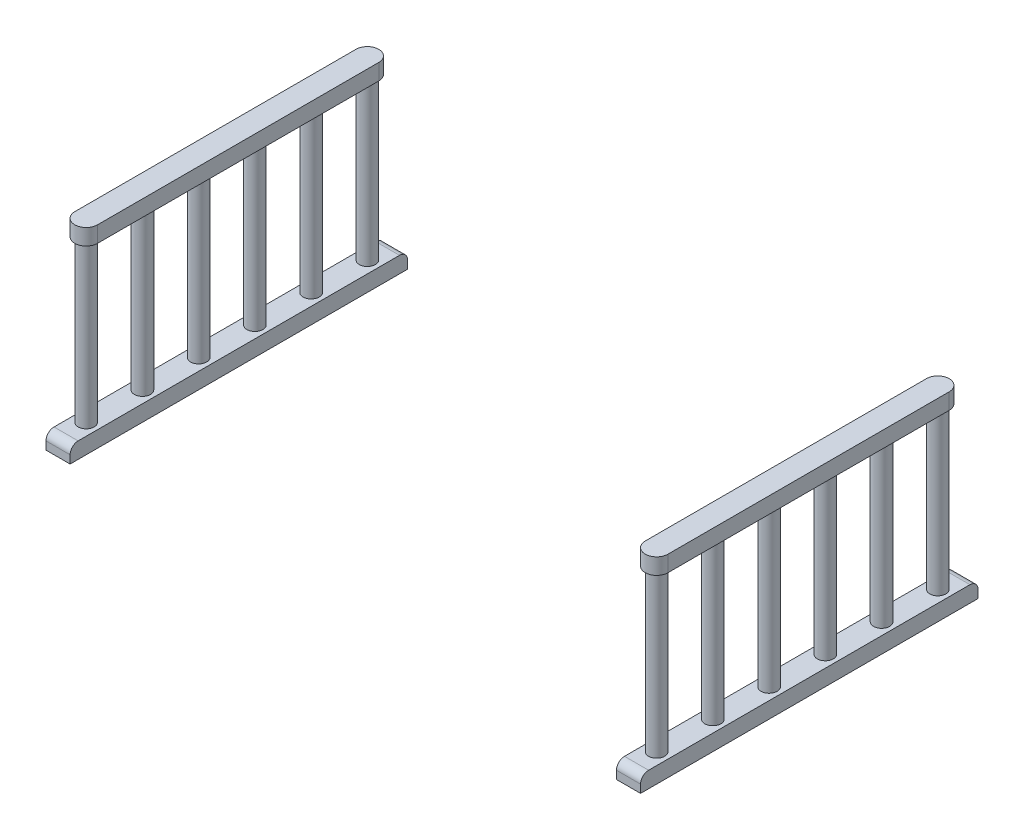
ISO-10303-21;
HEADER;
FILE_DESCRIPTION(('STEP AP214'),'2;1');
FILE_NAME('part.step','',(''),(''),'','','');
FILE_SCHEMA(('AUTOMOTIVE_DESIGN { 1 0 10303 214 1 1 1 1 }'));
ENDSEC;
DATA;
#1=APPLICATION_CONTEXT('core data for automotive mechanical design processes');
#2=APPLICATION_PROTOCOL_DEFINITION('international standard','automotive_design',2000,#1);
#3=PRODUCT_CONTEXT('',#1,'mechanical');
#4=PRODUCT('Part','Part','',(#3));
#5=PRODUCT_RELATED_PRODUCT_CATEGORY('part','',(#4));
#6=PRODUCT_DEFINITION_FORMATION('','',#4);
#7=PRODUCT_DEFINITION_CONTEXT('part definition',#1,'design');
#8=PRODUCT_DEFINITION('design','',#6,#7);
#9=PRODUCT_DEFINITION_SHAPE('','',#8);
#10=(LENGTH_UNIT() NAMED_UNIT(*) SI_UNIT(.MILLI.,.METRE.));
#11=(NAMED_UNIT(*) PLANE_ANGLE_UNIT() SI_UNIT($,.RADIAN.));
#12=(NAMED_UNIT(*) SI_UNIT($,.STERADIAN.) SOLID_ANGLE_UNIT());
#13=UNCERTAINTY_MEASURE_WITH_UNIT(LENGTH_MEASURE(1.E-05),#10,'distance_accuracy_value','');
#14=(GEOMETRIC_REPRESENTATION_CONTEXT(3) GLOBAL_UNCERTAINTY_ASSIGNED_CONTEXT((#13)) GLOBAL_UNIT_ASSIGNED_CONTEXT((#10,
#11,#12)) REPRESENTATION_CONTEXT('',''));
#15=CARTESIAN_POINT('',(0.,0.,0.));
#16=DIRECTION('',(0.,0.,1.));
#17=DIRECTION('',(1.,0.,0.));
#18=AXIS2_PLACEMENT_3D('',#15,#16,#17);
#19=CARTESIAN_POINT('',(-1775.,1100.,-1912.97595190381));
#20=DIRECTION('',(0.,-1.,0.));
#21=DIRECTION('',(0.,0.,-1.));
#22=AXIS2_PLACEMENT_3D('',#19,#20,#21);
#23=CYLINDRICAL_SURFACE('',#22,50.);
#24=CARTESIAN_POINT('',(-1775.,1100.,-1912.97595190381));
#25=DIRECTION('',(0.,1.,0.));
#26=DIRECTION('',(0.,0.,1.));
#27=AXIS2_PLACEMENT_3D('',#24,#25,#26);
#28=CIRCLE('',#27,50.);
#29=CARTESIAN_POINT('',(-1775.,1100.,-1862.97595190381));
#30=VERTEX_POINT('',#29);
#31=EDGE_CURVE('E244',#30,#30,#28,.T.);
#32=ORIENTED_EDGE('',*,*,#31,.F.);
#33=EDGE_LOOP('',(#32));
#34=FACE_BOUND('',#33,.T.);
#35=CARTESIAN_POINT('',(-1775.,100.,-1912.97595190381));
#36=DIRECTION('',(0.,-1.,0.));
#37=DIRECTION('',(0.,0.,-1.));
#38=AXIS2_PLACEMENT_3D('',#35,#36,#37);
#39=CIRCLE('',#38,50.);
#40=CARTESIAN_POINT('',(-1775.,100.,-1962.97595190381));
#41=VERTEX_POINT('',#40);
#42=EDGE_CURVE('E240',#41,#41,#39,.F.);
#43=ORIENTED_EDGE('',*,*,#42,.T.);
#44=EDGE_LOOP('',(#43));
#45=FACE_BOUND('',#44,.T.);
#46=ADVANCED_FACE('F55',(#34,#45),#23,.T.);
#47=CARTESIAN_POINT('',(-1775.,1100.,-1562.97595190381));
#48=DIRECTION('',(0.,-1.,0.));
#49=DIRECTION('',(0.,0.,-1.));
#50=AXIS2_PLACEMENT_3D('',#47,#48,#49);
#51=CYLINDRICAL_SURFACE('',#50,50.);
#52=CARTESIAN_POINT('',(-1775.,1100.,-1562.97595190381));
#53=DIRECTION('',(0.,1.,0.));
#54=DIRECTION('',(0.,0.,1.));
#55=AXIS2_PLACEMENT_3D('',#52,#53,#54);
#56=CIRCLE('',#55,50.);
#57=CARTESIAN_POINT('',(-1775.,1100.,-1512.97595190381));
#58=VERTEX_POINT('',#57);
#59=EDGE_CURVE('E236',#58,#58,#56,.T.);
#60=ORIENTED_EDGE('',*,*,#59,.F.);
#61=EDGE_LOOP('',(#60));
#62=FACE_BOUND('',#61,.T.);
#63=CARTESIAN_POINT('',(-1775.,100.,-1562.97595190381));
#64=DIRECTION('',(0.,-1.,0.));
#65=DIRECTION('',(0.,0.,-1.));
#66=AXIS2_PLACEMENT_3D('',#63,#64,#65);
#67=CIRCLE('',#66,50.);
#68=CARTESIAN_POINT('',(-1775.,100.,-1612.97595190381));
#69=VERTEX_POINT('',#68);
#70=EDGE_CURVE('E232',#69,#69,#67,.F.);
#71=ORIENTED_EDGE('',*,*,#70,.T.);
#72=EDGE_LOOP('',(#71));
#73=FACE_BOUND('',#72,.T.);
#74=ADVANCED_FACE('F294',(#62,#73),#51,.T.);
#75=CARTESIAN_POINT('',(-1775.,1100.,-1212.97595190381));
#76=DIRECTION('',(0.,-1.,0.));
#77=DIRECTION('',(0.,0.,-1.));
#78=AXIS2_PLACEMENT_3D('',#75,#76,#77);
#79=CYLINDRICAL_SURFACE('',#78,50.);
#80=CARTESIAN_POINT('',(-1775.,1100.,-1212.97595190381));
#81=DIRECTION('',(0.,1.,0.));
#82=DIRECTION('',(0.,0.,1.));
#83=AXIS2_PLACEMENT_3D('',#80,#81,#82);
#84=CIRCLE('',#83,50.);
#85=CARTESIAN_POINT('',(-1775.,1100.,-1162.97595190381));
#86=VERTEX_POINT('',#85);
#87=EDGE_CURVE('E228',#86,#86,#84,.T.);
#88=ORIENTED_EDGE('',*,*,#87,.F.);
#89=EDGE_LOOP('',(#88));
#90=FACE_BOUND('',#89,.T.);
#91=CARTESIAN_POINT('',(-1775.,100.,-1212.97595190381));
#92=DIRECTION('',(0.,-1.,0.));
#93=DIRECTION('',(0.,0.,-1.));
#94=AXIS2_PLACEMENT_3D('',#91,#92,#93);
#95=CIRCLE('',#94,50.);
#96=CARTESIAN_POINT('',(-1775.,100.,-1262.97595190381));
#97=VERTEX_POINT('',#96);
#98=EDGE_CURVE('E224',#97,#97,#95,.F.);
#99=ORIENTED_EDGE('',*,*,#98,.T.);
#100=EDGE_LOOP('',(#99));
#101=FACE_BOUND('',#100,.T.);
#102=ADVANCED_FACE('F301',(#90,#101),#79,.T.);
#103=CARTESIAN_POINT('',(-1775.,1100.,-862.975951903808));
#104=DIRECTION('',(0.,-1.,0.));
#105=DIRECTION('',(0.,0.,-1.));
#106=AXIS2_PLACEMENT_3D('',#103,#104,#105);
#107=CYLINDRICAL_SURFACE('',#106,50.);
#108=CARTESIAN_POINT('',(-1775.,1100.,-862.975951903808));
#109=DIRECTION('',(0.,1.,0.));
#110=DIRECTION('',(0.,0.,1.));
#111=AXIS2_PLACEMENT_3D('',#108,#109,#110);
#112=CIRCLE('',#111,50.);
#113=CARTESIAN_POINT('',(-1775.,1100.,-812.975951903807));
#114=VERTEX_POINT('',#113);
#115=EDGE_CURVE('E220',#114,#114,#112,.T.);
#116=ORIENTED_EDGE('',*,*,#115,.F.);
#117=EDGE_LOOP('',(#116));
#118=FACE_BOUND('',#117,.T.);
#119=CARTESIAN_POINT('',(-1775.,100.,-862.975951903808));
#120=DIRECTION('',(0.,-1.,0.));
#121=DIRECTION('',(0.,0.,-1.));
#122=AXIS2_PLACEMENT_3D('',#119,#120,#121);
#123=CIRCLE('',#122,50.);
#124=CARTESIAN_POINT('',(-1775.,100.,-912.975951903808));
#125=VERTEX_POINT('',#124);
#126=EDGE_CURVE('E216',#125,#125,#123,.F.);
#127=ORIENTED_EDGE('',*,*,#126,.T.);
#128=EDGE_LOOP('',(#127));
#129=FACE_BOUND('',#128,.T.);
#130=ADVANCED_FACE('F309',(#118,#129),#107,.T.);
#131=CARTESIAN_POINT('',(-1850.,100.,12.0240480961924));
#132=DIRECTION('',(1.,0.,0.));
#133=DIRECTION('',(0.,0.,-1.));
#134=AXIS2_PLACEMENT_3D('',#131,#132,#133);
#135=PLANE('',#134);
#136=DIRECTION('',(0.,-1.,0.));
#137=VECTOR('',#136,1.);
#138=CARTESIAN_POINT('',(-1850.,100.,12.0240480961924));
#139=LINE('',#138,#137);
#140=CARTESIAN_POINT('',(-1850.,50.,12.0240480961924));
#141=VERTEX_POINT('',#140);
#142=CARTESIAN_POINT('',(-1850.,0.,12.0240480961924));
#143=VERTEX_POINT('',#142);
#144=EDGE_CURVE('E173',#141,#143,#139,.T.);
#145=ORIENTED_EDGE('',*,*,#144,.F.);
#146=CARTESIAN_POINT('',(-1850.,50.,-37.9759519038076));
#147=DIRECTION('',(1.,0.,0.));
#148=DIRECTION('',(0.,0.,-1.));
#149=AXIS2_PLACEMENT_3D('',#146,#147,#148);
#150=CIRCLE('',#149,50.);
#151=CARTESIAN_POINT('',(-1850.,100.,-37.9759519038076));
#152=VERTEX_POINT('',#151);
#153=EDGE_CURVE('E12',#141,#152,#150,.F.);
#154=ORIENTED_EDGE('',*,*,#153,.T.);
#155=DIRECTION('',(0.,0.,1.));
#156=VECTOR('',#155,1.);
#157=CARTESIAN_POINT('',(-1850.,100.,12.0240480961924));
#158=LINE('',#157,#156);
#159=CARTESIAN_POINT('',(-1850.,100.,-2037.97595190381));
#160=VERTEX_POINT('',#159);
#161=EDGE_CURVE('E191',#160,#152,#158,.T.);
#162=ORIENTED_EDGE('',*,*,#161,.F.);
#163=CARTESIAN_POINT('',(-1850.,50.,-2037.97595190381));
#164=DIRECTION('',(1.,0.,0.));
#165=DIRECTION('',(0.,0.,-1.));
#166=AXIS2_PLACEMENT_3D('',#163,#164,#165);
#167=CIRCLE('',#166,50.);
#168=CARTESIAN_POINT('',(-1850.,50.,-2087.97595190381));
#169=VERTEX_POINT('',#168);
#170=EDGE_CURVE('E252',#160,#169,#167,.F.);
#171=ORIENTED_EDGE('',*,*,#170,.T.);
#172=DIRECTION('',(0.,-1.,0.));
#173=VECTOR('',#172,1.);
#174=CARTESIAN_POINT('',(-1850.,100.,-2087.97595190381));
#175=LINE('',#174,#173);
#176=CARTESIAN_POINT('',(-1850.,0.,-2087.97595190381));
#177=VERTEX_POINT('',#176);
#178=EDGE_CURVE('E182',#169,#177,#175,.T.);
#179=ORIENTED_EDGE('',*,*,#178,.T.);
#180=DIRECTION('',(0.,0.,1.));
#181=VECTOR('',#180,1.);
#182=CARTESIAN_POINT('',(-1850.,0.,12.0240480961924));
#183=LINE('',#182,#181);
#184=EDGE_CURVE('E199',#177,#143,#183,.T.);
#185=ORIENTED_EDGE('',*,*,#184,.T.);
#186=EDGE_LOOP('',(#145,#154,#162,#171,#179,#185));
#187=FACE_BOUND('',#186,.T.);
#188=ADVANCED_FACE('F283',(#187),#135,.F.);
#189=CARTESIAN_POINT('',(-1850.,100.,12.0240480961924));
#190=DIRECTION('',(0.,0.,-1.));
#191=DIRECTION('',(-1.,0.,0.));
#192=AXIS2_PLACEMENT_3D('',#189,#190,#191);
#193=PLANE('',#192);
#194=DIRECTION('',(0.,-1.,0.));
#195=VECTOR('',#194,1.);
#196=CARTESIAN_POINT('',(-1700.,100.,12.0240480961924));
#197=LINE('',#196,#195);
#198=CARTESIAN_POINT('',(-1700.,50.,12.0240480961924));
#199=VERTEX_POINT('',#198);
#200=CARTESIAN_POINT('',(-1700.,0.,12.0240480961924));
#201=VERTEX_POINT('',#200);
#202=EDGE_CURVE('E176',#199,#201,#197,.T.);
#203=ORIENTED_EDGE('',*,*,#202,.F.);
#204=DIRECTION('',(1.,0.,0.));
#205=VECTOR('',#204,1.);
#206=CARTESIAN_POINT('',(-1850.,50.,12.0240480961924));
#207=LINE('',#206,#205);
#208=EDGE_CURVE('E64',#199,#141,#207,.F.);
#209=ORIENTED_EDGE('',*,*,#208,.T.);
#210=ORIENTED_EDGE('',*,*,#144,.T.);
#211=DIRECTION('',(1.,0.,0.));
#212=VECTOR('',#211,1.);
#213=CARTESIAN_POINT('',(-1850.,0.,12.0240480961924));
#214=LINE('',#213,#212);
#215=EDGE_CURVE('E195',#143,#201,#214,.T.);
#216=ORIENTED_EDGE('',*,*,#215,.T.);
#217=EDGE_LOOP('',(#203,#209,#210,#216));
#218=FACE_BOUND('',#217,.T.);
#219=ADVANCED_FACE('F327',(#218),#193,.F.);
#220=CARTESIAN_POINT('',(-1700.,100.,12.0240480961924));
#221=DIRECTION('',(-1.,0.,0.));
#222=DIRECTION('',(0.,0.,1.));
#223=AXIS2_PLACEMENT_3D('',#220,#221,#222);
#224=PLANE('',#223);
#225=DIRECTION('',(0.,0.,-1.));
#226=VECTOR('',#225,1.);
#227=CARTESIAN_POINT('',(-1700.,100.,12.0240480961924));
#228=LINE('',#227,#226);
#229=CARTESIAN_POINT('',(-1700.,100.,-37.9759519038076));
#230=VERTEX_POINT('',#229);
#231=CARTESIAN_POINT('',(-1700.,100.,-2037.97595190381));
#232=VERTEX_POINT('',#231);
#233=EDGE_CURVE('E185',#230,#232,#228,.T.);
#234=ORIENTED_EDGE('',*,*,#233,.F.);
#235=CARTESIAN_POINT('',(-1700.,50.,-37.9759519038076));
#236=DIRECTION('',(-1.,0.,0.));
#237=DIRECTION('',(0.,0.,1.));
#238=AXIS2_PLACEMENT_3D('',#235,#236,#237);
#239=CIRCLE('',#238,50.);
#240=EDGE_CURVE('E78',#230,#199,#239,.F.);
#241=ORIENTED_EDGE('',*,*,#240,.T.);
#242=ORIENTED_EDGE('',*,*,#202,.T.);
#243=DIRECTION('',(0.,0.,-1.));
#244=VECTOR('',#243,1.);
#245=CARTESIAN_POINT('',(-1700.,0.,12.0240480961924));
#246=LINE('',#245,#244);
#247=CARTESIAN_POINT('',(-1700.,0.,-2087.97595190381));
#248=VERTEX_POINT('',#247);
#249=EDGE_CURVE('E190',#201,#248,#246,.T.);
#250=ORIENTED_EDGE('',*,*,#249,.T.);
#251=DIRECTION('',(0.,-1.,0.));
#252=VECTOR('',#251,1.);
#253=CARTESIAN_POINT('',(-1700.,100.,-2087.97595190381));
#254=LINE('',#253,#252);
#255=CARTESIAN_POINT('',(-1700.,50.,-2087.97595190381));
#256=VERTEX_POINT('',#255);
#257=EDGE_CURVE('E179',#256,#248,#254,.T.);
#258=ORIENTED_EDGE('',*,*,#257,.F.);
#259=CARTESIAN_POINT('',(-1700.,50.,-2037.97595190381));
#260=DIRECTION('',(-1.,0.,0.));
#261=DIRECTION('',(0.,0.,1.));
#262=AXIS2_PLACEMENT_3D('',#259,#260,#261);
#263=CIRCLE('',#262,50.);
#264=EDGE_CURVE('E258',#256,#232,#263,.F.);
#265=ORIENTED_EDGE('',*,*,#264,.T.);
#266=EDGE_LOOP('',(#234,#241,#242,#250,#258,#265));
#267=FACE_BOUND('',#266,.T.);
#268=ADVANCED_FACE('F275',(#267),#224,.F.);
#269=CARTESIAN_POINT('',(-1850.,100.,-2087.97595190381));
#270=DIRECTION('',(0.,0.,1.));
#271=DIRECTION('',(1.,0.,0.));
#272=AXIS2_PLACEMENT_3D('',#269,#270,#271);
#273=PLANE('',#272);
#274=ORIENTED_EDGE('',*,*,#178,.F.);
#275=DIRECTION('',(-1.,0.,0.));
#276=VECTOR('',#275,1.);
#277=CARTESIAN_POINT('',(-1850.,50.,-2087.97595190381));
#278=LINE('',#277,#276);
#279=EDGE_CURVE('E255',#169,#256,#278,.F.);
#280=ORIENTED_EDGE('',*,*,#279,.T.);
#281=ORIENTED_EDGE('',*,*,#257,.T.);
#282=DIRECTION('',(-1.,0.,0.));
#283=VECTOR('',#282,1.);
#284=CARTESIAN_POINT('',(-1850.,0.,-2087.97595190381));
#285=LINE('',#284,#283);
#286=EDGE_CURVE('E186',#248,#177,#285,.T.);
#287=ORIENTED_EDGE('',*,*,#286,.T.);
#288=EDGE_LOOP('',(#274,#280,#281,#287));
#289=FACE_BOUND('',#288,.T.);
#290=ADVANCED_FACE('F316',(#289),#273,.F.);
#291=CARTESIAN_POINT('',(0.,100.,0.));
#292=DIRECTION('',(0.,-1.,0.));
#293=DIRECTION('',(0.,0.,-1.));
#294=AXIS2_PLACEMENT_3D('',#291,#292,#293);
#295=PLANE('',#294);
#296=CARTESIAN_POINT('',(-1775.,100.,-512.975951903808));
#297=DIRECTION('',(0.,-1.,0.));
#298=DIRECTION('',(0.,0.,-1.));
#299=AXIS2_PLACEMENT_3D('',#296,#297,#298);
#300=CIRCLE('',#299,50.);
#301=CARTESIAN_POINT('',(-1775.,100.,-562.975951903808));
#302=VERTEX_POINT('',#301);
#303=EDGE_CURVE('E212',#302,#302,#300,.F.);
#304=ORIENTED_EDGE('',*,*,#303,.F.);
#305=EDGE_LOOP('',(#304));
#306=FACE_BOUND('',#305,.T.);
#307=CARTESIAN_POINT('',(-1775.,100.,-162.975951903808));
#308=DIRECTION('',(0.,-1.,0.));
#309=DIRECTION('',(0.,0.,-1.));
#310=AXIS2_PLACEMENT_3D('',#307,#308,#309);
#311=CIRCLE('',#310,50.);
#312=CARTESIAN_POINT('',(-1775.,100.,-212.975951903808));
#313=VERTEX_POINT('',#312);
#314=EDGE_CURVE('E203',#313,#313,#311,.F.);
#315=ORIENTED_EDGE('',*,*,#314,.F.);
#316=EDGE_LOOP('',(#315));
#317=FACE_BOUND('',#316,.T.);
#318=ORIENTED_EDGE('',*,*,#161,.T.);
#319=DIRECTION('',(1.,0.,0.));
#320=VECTOR('',#319,1.);
#321=CARTESIAN_POINT('',(0.,100.,-37.9759519038076));
#322=LINE('',#321,#320);
#323=EDGE_CURVE('E262',#152,#230,#322,.T.);
#324=ORIENTED_EDGE('',*,*,#323,.T.);
#325=ORIENTED_EDGE('',*,*,#233,.T.);
#326=DIRECTION('',(-1.,0.,0.));
#327=VECTOR('',#326,1.);
#328=CARTESIAN_POINT('',(0.,100.,-2037.97595190381));
#329=LINE('',#328,#327);
#330=EDGE_CURVE('E248',#232,#160,#329,.T.);
#331=ORIENTED_EDGE('',*,*,#330,.T.);
#332=EDGE_LOOP('',(#318,#324,#325,#331));
#333=FACE_BOUND('',#332,.T.);
#334=ORIENTED_EDGE('',*,*,#126,.F.);
#335=EDGE_LOOP('',(#334));
#336=FACE_BOUND('',#335,.T.);
#337=ORIENTED_EDGE('',*,*,#98,.F.);
#338=EDGE_LOOP('',(#337));
#339=FACE_BOUND('',#338,.T.);
#340=ORIENTED_EDGE('',*,*,#70,.F.);
#341=EDGE_LOOP('',(#340));
#342=FACE_BOUND('',#341,.T.);
#343=ORIENTED_EDGE('',*,*,#42,.F.);
#344=EDGE_LOOP('',(#343));
#345=FACE_BOUND('',#344,.T.);
#346=ADVANCED_FACE('F270',(#306,#317,#333,#336,#339,#342,#345),#295,.F.);
#347=CARTESIAN_POINT('',(0.,0.,0.));
#348=DIRECTION('',(0.,-1.,0.));
#349=DIRECTION('',(0.,0.,-1.));
#350=AXIS2_PLACEMENT_3D('',#347,#348,#349);
#351=PLANE('',#350);
#352=ORIENTED_EDGE('',*,*,#184,.F.);
#353=ORIENTED_EDGE('',*,*,#286,.F.);
#354=ORIENTED_EDGE('',*,*,#249,.F.);
#355=ORIENTED_EDGE('',*,*,#215,.F.);
#356=EDGE_LOOP('',(#352,#353,#354,#355));
#357=FACE_BOUND('',#356,.T.);
#358=ADVANCED_FACE('F315',(#357),#351,.T.);
#359=CARTESIAN_POINT('',(-1775.,1100.,-162.975951903808));
#360=DIRECTION('',(0.,-1.,0.));
#361=DIRECTION('',(0.,0.,-1.));
#362=AXIS2_PLACEMENT_3D('',#359,#360,#361);
#363=CYLINDRICAL_SURFACE('',#362,50.);
#364=CARTESIAN_POINT('',(-1775.,1100.,-162.975951903808));
#365=DIRECTION('',(0.,1.,0.));
#366=DIRECTION('',(0.,0.,1.));
#367=AXIS2_PLACEMENT_3D('',#364,#365,#366);
#368=CIRCLE('',#367,50.);
#369=CARTESIAN_POINT('',(-1775.,1100.,-112.975951903808));
#370=VERTEX_POINT('',#369);
#371=EDGE_CURVE('E164',#370,#370,#368,.T.);
#372=ORIENTED_EDGE('',*,*,#371,.F.);
#373=EDGE_LOOP('',(#372));
#374=FACE_BOUND('',#373,.T.);
#375=ORIENTED_EDGE('',*,*,#314,.T.);
#376=EDGE_LOOP('',(#375));
#377=FACE_BOUND('',#376,.T.);
#378=ADVANCED_FACE('F320',(#374,#377),#363,.T.);
#379=CARTESIAN_POINT('',(-1775.,1100.,-512.975951903808));
#380=DIRECTION('',(0.,-1.,0.));
#381=DIRECTION('',(0.,0.,-1.));
#382=AXIS2_PLACEMENT_3D('',#379,#380,#381);
#383=CYLINDRICAL_SURFACE('',#382,50.);
#384=CARTESIAN_POINT('',(-1775.,1100.,-512.975951903808));
#385=DIRECTION('',(0.,1.,0.));
#386=DIRECTION('',(0.,0.,1.));
#387=AXIS2_PLACEMENT_3D('',#384,#385,#386);
#388=CIRCLE('',#387,50.);
#389=CARTESIAN_POINT('',(-1775.,1100.,-462.975951903807));
#390=VERTEX_POINT('',#389);
#391=EDGE_CURVE('E159',#390,#390,#388,.T.);
#392=ORIENTED_EDGE('',*,*,#391,.F.);
#393=EDGE_LOOP('',(#392));
#394=FACE_BOUND('',#393,.T.);
#395=ORIENTED_EDGE('',*,*,#303,.T.);
#396=EDGE_LOOP('',(#395));
#397=FACE_BOUND('',#396,.T.);
#398=ADVANCED_FACE('F292',(#394,#397),#383,.T.);
#399=CARTESIAN_POINT('',(0.,50.,-2037.97595190381));
#400=DIRECTION('',(-1.,0.,0.));
#401=DIRECTION('',(0.,0.,1.));
#402=AXIS2_PLACEMENT_3D('',#399,#400,#401);
#403=CYLINDRICAL_SURFACE('',#402,50.);
#404=ORIENTED_EDGE('',*,*,#264,.F.);
#405=ORIENTED_EDGE('',*,*,#279,.F.);
#406=ORIENTED_EDGE('',*,*,#170,.F.);
#407=ORIENTED_EDGE('',*,*,#330,.F.);
#408=EDGE_LOOP('',(#404,#405,#406,#407));
#409=FACE_BOUND('',#408,.T.);
#410=ADVANCED_FACE('F281',(#409),#403,.T.);
#411=CARTESIAN_POINT('',(0.,50.,-37.9759519038076));
#412=DIRECTION('',(1.,0.,0.));
#413=DIRECTION('',(0.,0.,-1.));
#414=AXIS2_PLACEMENT_3D('',#411,#412,#413);
#415=CYLINDRICAL_SURFACE('',#414,50.);
#416=ORIENTED_EDGE('',*,*,#153,.F.);
#417=ORIENTED_EDGE('',*,*,#208,.F.);
#418=ORIENTED_EDGE('',*,*,#240,.F.);
#419=ORIENTED_EDGE('',*,*,#323,.F.);
#420=EDGE_LOOP('',(#416,#417,#418,#419));
#421=FACE_BOUND('',#420,.T.);
#422=ADVANCED_FACE('F57',(#421),#415,.T.);
#423=CARTESIAN_POINT('',(-1775.,1200.,-162.975951903808));
#424=DIRECTION('',(0.,-1.,0.));
#425=DIRECTION('',(0.,0.,-1.));
#426=AXIS2_PLACEMENT_3D('',#423,#424,#425);
#427=CYLINDRICAL_SURFACE('',#426,70.8383393209071);
#428=CARTESIAN_POINT('',(-1775.,1100.,-162.975951903808));
#429=DIRECTION('',(0.,1.,0.));
#430=DIRECTION('',(0.,0.,1.));
#431=AXIS2_PLACEMENT_3D('',#428,#429,#430);
#432=CIRCLE('',#431,70.8383393209071);
#433=CARTESIAN_POINT('',(-1845.83833932091,1100.,-162.975951903808));
#434=VERTEX_POINT('',#433);
#435=CARTESIAN_POINT('',(-1704.16166067909,1100.,-162.975951903808));
#436=VERTEX_POINT('',#435);
#437=EDGE_CURVE('E157',#434,#436,#432,.T.);
#438=ORIENTED_EDGE('',*,*,#437,.T.);
#439=DIRECTION('',(0.,-1.,0.));
#440=VECTOR('',#439,1.);
#441=CARTESIAN_POINT('',(-1704.16166067909,1200.,-162.975951903808));
#442=LINE('',#441,#440);
#443=CARTESIAN_POINT('',(-1704.16166067909,1200.,-162.975951903808));
#444=VERTEX_POINT('',#443);
#445=EDGE_CURVE('E135',#444,#436,#442,.T.);
#446=ORIENTED_EDGE('',*,*,#445,.F.);
#447=CARTESIAN_POINT('',(-1775.,1200.,-162.975951903808));
#448=DIRECTION('',(0.,1.,0.));
#449=DIRECTION('',(0.,0.,1.));
#450=AXIS2_PLACEMENT_3D('',#447,#448,#449);
#451=CIRCLE('',#450,70.8383393209071);
#452=CARTESIAN_POINT('',(-1845.83833932091,1200.,-162.975951903808));
#453=VERTEX_POINT('',#452);
#454=EDGE_CURVE('E143',#453,#444,#451,.T.);
#455=ORIENTED_EDGE('',*,*,#454,.F.);
#456=DIRECTION('',(0.,-1.,0.));
#457=VECTOR('',#456,1.);
#458=CARTESIAN_POINT('',(-1845.83833932091,1200.,-162.975951903808));
#459=LINE('',#458,#457);
#460=EDGE_CURVE('E494',#453,#434,#459,.T.);
#461=ORIENTED_EDGE('',*,*,#460,.T.);
#462=EDGE_LOOP('',(#438,#446,#455,#461));
#463=FACE_BOUND('',#462,.T.);
#464=ADVANCED_FACE('F155',(#463),#427,.T.);
#465=CARTESIAN_POINT('',(-1704.16166067909,1200.,-162.975951903808));
#466=DIRECTION('',(-1.,0.,0.));
#467=DIRECTION('',(0.,0.,1.));
#468=AXIS2_PLACEMENT_3D('',#465,#466,#467);
#469=PLANE('',#468);
#470=DIRECTION('',(0.,0.,-1.));
#471=VECTOR('',#470,1.);
#472=CARTESIAN_POINT('',(-1704.16166067909,1100.,-162.975951903808));
#473=LINE('',#472,#471);
#474=CARTESIAN_POINT('',(-1704.16166067909,1100.,-1912.97595190381));
#475=VERTEX_POINT('',#474);
#476=EDGE_CURVE('E481',#436,#475,#473,.T.);
#477=ORIENTED_EDGE('',*,*,#476,.T.);
#478=DIRECTION('',(0.,-1.,0.));
#479=VECTOR('',#478,1.);
#480=CARTESIAN_POINT('',(-1704.16166067909,1200.,-1912.97595190381));
#481=LINE('',#480,#479);
#482=CARTESIAN_POINT('',(-1704.16166067909,1200.,-1912.97595190381));
#483=VERTEX_POINT('',#482);
#484=EDGE_CURVE('E138',#483,#475,#481,.T.);
#485=ORIENTED_EDGE('',*,*,#484,.F.);
#486=DIRECTION('',(0.,0.,-1.));
#487=VECTOR('',#486,1.);
#488=CARTESIAN_POINT('',(-1704.16166067909,1200.,-162.975951903808));
#489=LINE('',#488,#487);
#490=EDGE_CURVE('E131',#444,#483,#489,.T.);
#491=ORIENTED_EDGE('',*,*,#490,.F.);
#492=ORIENTED_EDGE('',*,*,#445,.T.);
#493=EDGE_LOOP('',(#477,#485,#491,#492));
#494=FACE_BOUND('',#493,.T.);
#495=ADVANCED_FACE('F133',(#494),#469,.F.);
#496=CARTESIAN_POINT('',(-1775.,1200.,-1912.97595190381));
#497=DIRECTION('',(0.,-1.,0.));
#498=DIRECTION('',(0.,0.,-1.));
#499=AXIS2_PLACEMENT_3D('',#496,#497,#498);
#500=CYLINDRICAL_SURFACE('',#499,70.8383393209071);
#501=CARTESIAN_POINT('',(-1775.,1100.,-1912.97595190381));
#502=DIRECTION('',(0.,1.,0.));
#503=DIRECTION('',(0.,0.,1.));
#504=AXIS2_PLACEMENT_3D('',#501,#502,#503);
#505=CIRCLE('',#504,70.8383393209071);
#506=CARTESIAN_POINT('',(-1845.83833932091,1100.,-1912.97595190381));
#507=VERTEX_POINT('',#506);
#508=EDGE_CURVE('E485',#475,#507,#505,.T.);
#509=ORIENTED_EDGE('',*,*,#508,.T.);
#510=DIRECTION('',(0.,-1.,0.));
#511=VECTOR('',#510,1.);
#512=CARTESIAN_POINT('',(-1845.83833932091,1200.,-1912.97595190381));
#513=LINE('',#512,#511);
#514=CARTESIAN_POINT('',(-1845.83833932091,1200.,-1912.97595190381));
#515=VERTEX_POINT('',#514);
#516=EDGE_CURVE('E166',#515,#507,#513,.T.);
#517=ORIENTED_EDGE('',*,*,#516,.F.);
#518=CARTESIAN_POINT('',(-1775.,1200.,-1912.97595190381));
#519=DIRECTION('',(0.,1.,0.));
#520=DIRECTION('',(0.,0.,1.));
#521=AXIS2_PLACEMENT_3D('',#518,#519,#520);
#522=CIRCLE('',#521,70.8383393209071);
#523=EDGE_CURVE('E142',#483,#515,#522,.T.);
#524=ORIENTED_EDGE('',*,*,#523,.F.);
#525=ORIENTED_EDGE('',*,*,#484,.T.);
#526=EDGE_LOOP('',(#509,#517,#524,#525));
#527=FACE_BOUND('',#526,.T.);
#528=ADVANCED_FACE('F339',(#527),#500,.T.);
#529=CARTESIAN_POINT('',(-1845.83833932091,1200.,-162.975951903808));
#530=DIRECTION('',(1.,0.,0.));
#531=DIRECTION('',(0.,0.,-1.));
#532=AXIS2_PLACEMENT_3D('',#529,#530,#531);
#533=PLANE('',#532);
#534=DIRECTION('',(0.,0.,1.));
#535=VECTOR('',#534,1.);
#536=CARTESIAN_POINT('',(-1845.83833932091,1100.,-162.975951903808));
#537=LINE('',#536,#535);
#538=EDGE_CURVE('E153',#507,#434,#537,.T.);
#539=ORIENTED_EDGE('',*,*,#538,.T.);
#540=ORIENTED_EDGE('',*,*,#460,.F.);
#541=DIRECTION('',(0.,0.,1.));
#542=VECTOR('',#541,1.);
#543=CARTESIAN_POINT('',(-1845.83833932091,1200.,-162.975951903808));
#544=LINE('',#543,#542);
#545=EDGE_CURVE('E148',#515,#453,#544,.T.);
#546=ORIENTED_EDGE('',*,*,#545,.F.);
#547=ORIENTED_EDGE('',*,*,#516,.T.);
#548=EDGE_LOOP('',(#539,#540,#546,#547));
#549=FACE_BOUND('',#548,.T.);
#550=ADVANCED_FACE('F342',(#549),#533,.F.);
#551=CARTESIAN_POINT('',(-1775.,1200.,-162.975951903808));
#552=DIRECTION('',(0.,1.,0.));
#553=DIRECTION('',(0.,0.,1.));
#554=AXIS2_PLACEMENT_3D('',#551,#552,#553);
#555=PLANE('',#554);
#556=ORIENTED_EDGE('',*,*,#454,.T.);
#557=ORIENTED_EDGE('',*,*,#490,.T.);
#558=ORIENTED_EDGE('',*,*,#523,.T.);
#559=ORIENTED_EDGE('',*,*,#545,.T.);
#560=EDGE_LOOP('',(#556,#557,#558,#559));
#561=FACE_BOUND('',#560,.T.);
#562=ADVANCED_FACE('F146',(#561),#555,.T.);
#563=CARTESIAN_POINT('',(-1775.,1100.,-162.975951903808));
#564=DIRECTION('',(0.,1.,0.));
#565=DIRECTION('',(0.,0.,1.));
#566=AXIS2_PLACEMENT_3D('',#563,#564,#565);
#567=PLANE('',#566);
#568=ORIENTED_EDGE('',*,*,#31,.T.);
#569=EDGE_LOOP('',(#568));
#570=FACE_BOUND('',#569,.T.);
#571=ORIENTED_EDGE('',*,*,#59,.T.);
#572=EDGE_LOOP('',(#571));
#573=FACE_BOUND('',#572,.T.);
#574=ORIENTED_EDGE('',*,*,#87,.T.);
#575=EDGE_LOOP('',(#574));
#576=FACE_BOUND('',#575,.T.);
#577=ORIENTED_EDGE('',*,*,#115,.T.);
#578=EDGE_LOOP('',(#577));
#579=FACE_BOUND('',#578,.T.);
#580=ORIENTED_EDGE('',*,*,#371,.T.);
#581=EDGE_LOOP('',(#580));
#582=FACE_BOUND('',#581,.T.);
#583=ORIENTED_EDGE('',*,*,#391,.T.);
#584=EDGE_LOOP('',(#583));
#585=FACE_BOUND('',#584,.T.);
#586=ORIENTED_EDGE('',*,*,#437,.F.);
#587=ORIENTED_EDGE('',*,*,#538,.F.);
#588=ORIENTED_EDGE('',*,*,#508,.F.);
#589=ORIENTED_EDGE('',*,*,#476,.F.);
#590=EDGE_LOOP('',(#586,#587,#588,#589));
#591=FACE_BOUND('',#590,.T.);
#592=ADVANCED_FACE('F347',(#570,#573,#576,#579,#582,#585,#591),#567,.F.);
#593=CLOSED_SHELL('',(#46,#74,#102,#130,#188,#219,#268,#290,#346,#358,#378,#398,#410,#422,#464,
#495,#528,#550,#562,#592));
#594=MANIFOLD_SOLID_BREP('B2',#593);
#595=CARTESIAN_POINT('',(1775.,1100.,-162.975951903808));
#596=DIRECTION('',(0.,-1.,0.));
#597=DIRECTION('',(0.,0.,-1.));
#598=AXIS2_PLACEMENT_3D('',#595,#596,#597);
#599=CYLINDRICAL_SURFACE('',#598,50.);
#600=CARTESIAN_POINT('',(1775.,1100.,-162.975951903808));
#601=DIRECTION('',(0.,1.,0.));
#602=DIRECTION('',(0.,0.,1.));
#603=AXIS2_PLACEMENT_3D('',#600,#601,#602);
#604=CIRCLE('',#603,50.);
#605=CARTESIAN_POINT('',(1775.,1100.,-112.975951903808));
#606=VERTEX_POINT('',#605);
#607=EDGE_CURVE('E692',#606,#606,#604,.T.);
#608=ORIENTED_EDGE('',*,*,#607,.F.);
#609=EDGE_LOOP('',(#608));
#610=FACE_BOUND('',#609,.T.);
#611=CARTESIAN_POINT('',(1775.,100.,-162.975951903808));
#612=DIRECTION('',(0.,1.,0.));
#613=DIRECTION('',(0.,0.,1.));
#614=AXIS2_PLACEMENT_3D('',#611,#612,#613);
#615=CIRCLE('',#614,50.);
#616=CARTESIAN_POINT('',(1775.,100.,-112.975951903808));
#617=VERTEX_POINT('',#616);
#618=EDGE_CURVE('E689',#617,#617,#615,.T.);
#619=ORIENTED_EDGE('',*,*,#618,.T.);
#620=EDGE_LOOP('',(#619));
#621=FACE_BOUND('',#620,.T.);
#622=ADVANCED_FACE('F523',(#610,#621),#599,.T.);
#623=CARTESIAN_POINT('',(1775.,1100.,-512.975951903808));
#624=DIRECTION('',(0.,-1.,0.));
#625=DIRECTION('',(0.,0.,-1.));
#626=AXIS2_PLACEMENT_3D('',#623,#624,#625);
#627=CYLINDRICAL_SURFACE('',#626,50.);
#628=CARTESIAN_POINT('',(1775.,1100.,-512.975951903808));
#629=DIRECTION('',(0.,1.,0.));
#630=DIRECTION('',(0.,0.,1.));
#631=AXIS2_PLACEMENT_3D('',#628,#629,#630);
#632=CIRCLE('',#631,50.);
#633=CARTESIAN_POINT('',(1775.,1100.,-462.975951903808));
#634=VERTEX_POINT('',#633);
#635=EDGE_CURVE('E686',#634,#634,#632,.T.);
#636=ORIENTED_EDGE('',*,*,#635,.F.);
#637=EDGE_LOOP('',(#636));
#638=FACE_BOUND('',#637,.T.);
#639=CARTESIAN_POINT('',(1775.,100.,-512.975951903808));
#640=DIRECTION('',(0.,1.,0.));
#641=DIRECTION('',(0.,0.,1.));
#642=AXIS2_PLACEMENT_3D('',#639,#640,#641);
#643=CIRCLE('',#642,50.);
#644=CARTESIAN_POINT('',(1775.,100.,-462.975951903808));
#645=VERTEX_POINT('',#644);
#646=EDGE_CURVE('E683',#645,#645,#643,.T.);
#647=ORIENTED_EDGE('',*,*,#646,.T.);
#648=EDGE_LOOP('',(#647));
#649=FACE_BOUND('',#648,.T.);
#650=ADVANCED_FACE('F735',(#638,#649),#627,.T.);
#651=CARTESIAN_POINT('',(1775.,1100.,-862.975951903808));
#652=DIRECTION('',(0.,-1.,0.));
#653=DIRECTION('',(0.,0.,-1.));
#654=AXIS2_PLACEMENT_3D('',#651,#652,#653);
#655=CYLINDRICAL_SURFACE('',#654,50.);
#656=CARTESIAN_POINT('',(1775.,1100.,-862.975951903808));
#657=DIRECTION('',(0.,1.,0.));
#658=DIRECTION('',(0.,0.,1.));
#659=AXIS2_PLACEMENT_3D('',#656,#657,#658);
#660=CIRCLE('',#659,50.);
#661=CARTESIAN_POINT('',(1775.,1100.,-812.975951903808));
#662=VERTEX_POINT('',#661);
#663=EDGE_CURVE('E680',#662,#662,#660,.T.);
#664=ORIENTED_EDGE('',*,*,#663,.F.);
#665=EDGE_LOOP('',(#664));
#666=FACE_BOUND('',#665,.T.);
#667=CARTESIAN_POINT('',(1775.,100.,-862.975951903808));
#668=DIRECTION('',(0.,1.,0.));
#669=DIRECTION('',(0.,0.,1.));
#670=AXIS2_PLACEMENT_3D('',#667,#668,#669);
#671=CIRCLE('',#670,50.);
#672=CARTESIAN_POINT('',(1775.,100.,-812.975951903808));
#673=VERTEX_POINT('',#672);
#674=EDGE_CURVE('E677',#673,#673,#671,.T.);
#675=ORIENTED_EDGE('',*,*,#674,.T.);
#676=EDGE_LOOP('',(#675));
#677=FACE_BOUND('',#676,.T.);
#678=ADVANCED_FACE('F742',(#666,#677),#655,.T.);
#679=CARTESIAN_POINT('',(1775.,1100.,-1212.97595190381));
#680=DIRECTION('',(0.,-1.,0.));
#681=DIRECTION('',(0.,0.,-1.));
#682=AXIS2_PLACEMENT_3D('',#679,#680,#681);
#683=CYLINDRICAL_SURFACE('',#682,50.);
#684=CARTESIAN_POINT('',(1775.,1100.,-1212.97595190381));
#685=DIRECTION('',(0.,1.,0.));
#686=DIRECTION('',(0.,0.,1.));
#687=AXIS2_PLACEMENT_3D('',#684,#685,#686);
#688=CIRCLE('',#687,50.);
#689=CARTESIAN_POINT('',(1775.,1100.,-1162.97595190381));
#690=VERTEX_POINT('',#689);
#691=EDGE_CURVE('E674',#690,#690,#688,.T.);
#692=ORIENTED_EDGE('',*,*,#691,.F.);
#693=EDGE_LOOP('',(#692));
#694=FACE_BOUND('',#693,.T.);
#695=CARTESIAN_POINT('',(1775.,100.,-1212.97595190381));
#696=DIRECTION('',(0.,1.,0.));
#697=DIRECTION('',(0.,0.,1.));
#698=AXIS2_PLACEMENT_3D('',#695,#696,#697);
#699=CIRCLE('',#698,50.);
#700=CARTESIAN_POINT('',(1775.,100.,-1162.97595190381));
#701=VERTEX_POINT('',#700);
#702=EDGE_CURVE('E671',#701,#701,#699,.T.);
#703=ORIENTED_EDGE('',*,*,#702,.T.);
#704=EDGE_LOOP('',(#703));
#705=FACE_BOUND('',#704,.T.);
#706=ADVANCED_FACE('F750',(#694,#705),#683,.T.);
#707=CARTESIAN_POINT('',(1850.,100.,12.0240480961924));
#708=DIRECTION('',(-1.,0.,0.));
#709=DIRECTION('',(0.,0.,1.));
#710=AXIS2_PLACEMENT_3D('',#707,#708,#709);
#711=PLANE('',#710);
#712=DIRECTION('',(0.,-1.,0.));
#713=VECTOR('',#712,1.);
#714=CARTESIAN_POINT('',(1850.,100.,-2087.97595190381));
#715=LINE('',#714,#713);
#716=CARTESIAN_POINT('',(1850.,50.,-2087.97595190381));
#717=VERTEX_POINT('',#716);
#718=CARTESIAN_POINT('',(1850.,0.,-2087.97595190381));
#719=VERTEX_POINT('',#718);
#720=EDGE_CURVE('E669',#717,#719,#715,.T.);
#721=ORIENTED_EDGE('',*,*,#720,.F.);
#722=CARTESIAN_POINT('',(1850.,50.,-2037.97595190381));
#723=DIRECTION('',(-1.,0.,0.));
#724=DIRECTION('',(0.,0.,1.));
#725=AXIS2_PLACEMENT_3D('',#722,#723,#724);
#726=CIRCLE('',#725,50.);
#727=CARTESIAN_POINT('',(1850.,100.,-2037.97595190381));
#728=VERTEX_POINT('',#727);
#729=EDGE_CURVE('E53',#717,#728,#726,.F.);
#730=ORIENTED_EDGE('',*,*,#729,.T.);
#731=DIRECTION('',(0.,0.,-1.));
#732=VECTOR('',#731,1.);
#733=CARTESIAN_POINT('',(1850.,100.,12.0240480961924));
#734=LINE('',#733,#732);
#735=CARTESIAN_POINT('',(1850.,100.,-37.9759519038076));
#736=VERTEX_POINT('',#735);
#737=EDGE_CURVE('E647',#736,#728,#734,.T.);
#738=ORIENTED_EDGE('',*,*,#737,.F.);
#739=CARTESIAN_POINT('',(1850.,50.,-37.9759519038076));
#740=DIRECTION('',(-1.,0.,0.));
#741=DIRECTION('',(0.,0.,1.));
#742=AXIS2_PLACEMENT_3D('',#739,#740,#741);
#743=CIRCLE('',#742,50.);
#744=CARTESIAN_POINT('',(1850.,50.,12.0240480961924));
#745=VERTEX_POINT('',#744);
#746=EDGE_CURVE('E698',#736,#745,#743,.F.);
#747=ORIENTED_EDGE('',*,*,#746,.T.);
#748=DIRECTION('',(0.,-1.,0.));
#749=VECTOR('',#748,1.);
#750=CARTESIAN_POINT('',(1850.,100.,12.0240480961924));
#751=LINE('',#750,#749);
#752=CARTESIAN_POINT('',(1850.,0.,12.0240480961924));
#753=VERTEX_POINT('',#752);
#754=EDGE_CURVE('E653',#745,#753,#751,.T.);
#755=ORIENTED_EDGE('',*,*,#754,.T.);
#756=DIRECTION('',(0.,0.,-1.));
#757=VECTOR('',#756,1.);
#758=CARTESIAN_POINT('',(1850.,0.,12.0240480961924));
#759=LINE('',#758,#757);
#760=EDGE_CURVE('E644',#753,#719,#759,.T.);
#761=ORIENTED_EDGE('',*,*,#760,.T.);
#762=EDGE_LOOP('',(#721,#730,#738,#747,#755,#761));
#763=FACE_BOUND('',#762,.T.);
#764=ADVANCED_FACE('F723',(#763),#711,.F.);
#765=CARTESIAN_POINT('',(1850.,100.,-2087.97595190381));
#766=DIRECTION('',(0.,0.,1.));
#767=DIRECTION('',(1.,0.,0.));
#768=AXIS2_PLACEMENT_3D('',#765,#766,#767);
#769=PLANE('',#768);
#770=DIRECTION('',(0.,-1.,0.));
#771=VECTOR('',#770,1.);
#772=CARTESIAN_POINT('',(1700.,100.,-2087.97595190381));
#773=LINE('',#772,#771);
#774=CARTESIAN_POINT('',(1700.,50.,-2087.97595190381));
#775=VERTEX_POINT('',#774);
#776=CARTESIAN_POINT('',(1700.,0.,-2087.97595190381));
#777=VERTEX_POINT('',#776);
#778=EDGE_CURVE('E667',#775,#777,#773,.T.);
#779=ORIENTED_EDGE('',*,*,#778,.F.);
#780=DIRECTION('',(-1.,0.,0.));
#781=VECTOR('',#780,1.);
#782=CARTESIAN_POINT('',(1850.,50.,-2087.97595190381));
#783=LINE('',#782,#781);
#784=EDGE_CURVE('E531',#775,#717,#783,.F.);
#785=ORIENTED_EDGE('',*,*,#784,.T.);
#786=ORIENTED_EDGE('',*,*,#720,.T.);
#787=DIRECTION('',(-1.,0.,0.));
#788=VECTOR('',#787,1.);
#789=CARTESIAN_POINT('',(1850.,0.,-2087.97595190381));
#790=LINE('',#789,#788);
#791=EDGE_CURVE('E656',#719,#777,#790,.T.);
#792=ORIENTED_EDGE('',*,*,#791,.T.);
#793=EDGE_LOOP('',(#779,#785,#786,#792));
#794=FACE_BOUND('',#793,.T.);
#795=ADVANCED_FACE('F757',(#794),#769,.F.);
#796=CARTESIAN_POINT('',(1700.,100.,12.0240480961924));
#797=DIRECTION('',(1.,0.,0.));
#798=DIRECTION('',(0.,0.,-1.));
#799=AXIS2_PLACEMENT_3D('',#796,#797,#798);
#800=PLANE('',#799);
#801=DIRECTION('',(0.,0.,1.));
#802=VECTOR('',#801,1.);
#803=CARTESIAN_POINT('',(1700.,100.,12.0240480961924));
#804=LINE('',#803,#802);
#805=CARTESIAN_POINT('',(1700.,100.,-2037.97595190381));
#806=VERTEX_POINT('',#805);
#807=CARTESIAN_POINT('',(1700.,100.,-37.9759519038076));
#808=VERTEX_POINT('',#807);
#809=EDGE_CURVE('E650',#806,#808,#804,.T.);
#810=ORIENTED_EDGE('',*,*,#809,.F.);
#811=CARTESIAN_POINT('',(1700.,50.,-2037.97595190381));
#812=DIRECTION('',(1.,0.,0.));
#813=DIRECTION('',(0.,0.,-1.));
#814=AXIS2_PLACEMENT_3D('',#811,#812,#813);
#815=CIRCLE('',#814,50.);
#816=EDGE_CURVE('E545',#806,#775,#815,.F.);
#817=ORIENTED_EDGE('',*,*,#816,.T.);
#818=ORIENTED_EDGE('',*,*,#778,.T.);
#819=DIRECTION('',(0.,0.,1.));
#820=VECTOR('',#819,1.);
#821=CARTESIAN_POINT('',(1700.,0.,12.0240480961924));
#822=LINE('',#821,#820);
#823=CARTESIAN_POINT('',(1700.,0.,12.0240480961924));
#824=VERTEX_POINT('',#823);
#825=EDGE_CURVE('E659',#777,#824,#822,.T.);
#826=ORIENTED_EDGE('',*,*,#825,.T.);
#827=DIRECTION('',(0.,-1.,0.));
#828=VECTOR('',#827,1.);
#829=CARTESIAN_POINT('',(1700.,100.,12.0240480961924));
#830=LINE('',#829,#828);
#831=CARTESIAN_POINT('',(1700.,50.,12.0240480961924));
#832=VERTEX_POINT('',#831);
#833=EDGE_CURVE('E665',#832,#824,#830,.T.);
#834=ORIENTED_EDGE('',*,*,#833,.F.);
#835=CARTESIAN_POINT('',(1700.,50.,-37.9759519038076));
#836=DIRECTION('',(1.,0.,0.));
#837=DIRECTION('',(0.,0.,-1.));
#838=AXIS2_PLACEMENT_3D('',#835,#836,#837);
#839=CIRCLE('',#838,50.);
#840=EDGE_CURVE('E702',#832,#808,#839,.F.);
#841=ORIENTED_EDGE('',*,*,#840,.T.);
#842=EDGE_LOOP('',(#810,#817,#818,#826,#834,#841));
#843=FACE_BOUND('',#842,.T.);
#844=ADVANCED_FACE('F715',(#843),#800,.F.);
#845=CARTESIAN_POINT('',(1850.,100.,12.0240480961924));
#846=DIRECTION('',(0.,0.,-1.));
#847=DIRECTION('',(-1.,0.,0.));
#848=AXIS2_PLACEMENT_3D('',#845,#846,#847);
#849=PLANE('',#848);
#850=ORIENTED_EDGE('',*,*,#754,.F.);
#851=DIRECTION('',(1.,0.,0.));
#852=VECTOR('',#851,1.);
#853=CARTESIAN_POINT('',(1700.,50.,12.0240480961924));
#854=LINE('',#853,#852);
#855=EDGE_CURVE('E700',#745,#832,#854,.F.);
#856=ORIENTED_EDGE('',*,*,#855,.T.);
#857=ORIENTED_EDGE('',*,*,#833,.T.);
#858=DIRECTION('',(1.,0.,0.));
#859=VECTOR('',#858,1.);
#860=CARTESIAN_POINT('',(1850.,0.,12.0240480961924));
#861=LINE('',#860,#859);
#862=EDGE_CURVE('E651',#824,#753,#861,.T.);
#863=ORIENTED_EDGE('',*,*,#862,.T.);
#864=EDGE_LOOP('',(#850,#856,#857,#863));
#865=FACE_BOUND('',#864,.T.);
#866=ADVANCED_FACE('F762',(#865),#849,.F.);
#867=CARTESIAN_POINT('',(0.,100.,0.));
#868=DIRECTION('',(0.,1.,0.));
#869=DIRECTION('',(0.,0.,1.));
#870=AXIS2_PLACEMENT_3D('',#867,#868,#869);
#871=PLANE('',#870);
#872=CARTESIAN_POINT('',(1775.,100.,-1562.97595190381));
#873=DIRECTION('',(0.,1.,0.));
#874=DIRECTION('',(0.,0.,1.));
#875=AXIS2_PLACEMENT_3D('',#872,#873,#874);
#876=CIRCLE('',#875,50.);
#877=CARTESIAN_POINT('',(1775.,100.,-1512.97595190381));
#878=VERTEX_POINT('',#877);
#879=EDGE_CURVE('E624',#878,#878,#876,.T.);
#880=ORIENTED_EDGE('',*,*,#879,.F.);
#881=EDGE_LOOP('',(#880));
#882=FACE_BOUND('',#881,.T.);
#883=CARTESIAN_POINT('',(1775.,100.,-1912.97595190381));
#884=DIRECTION('',(0.,1.,0.));
#885=DIRECTION('',(0.,0.,1.));
#886=AXIS2_PLACEMENT_3D('',#883,#884,#885);
#887=CIRCLE('',#886,50.);
#888=CARTESIAN_POINT('',(1775.,100.,-1862.97595190381));
#889=VERTEX_POINT('',#888);
#890=EDGE_CURVE('E640',#889,#889,#887,.T.);
#891=ORIENTED_EDGE('',*,*,#890,.F.);
#892=EDGE_LOOP('',(#891));
#893=FACE_BOUND('',#892,.T.);
#894=ORIENTED_EDGE('',*,*,#737,.T.);
#895=DIRECTION('',(-1.,0.,0.));
#896=VECTOR('',#895,1.);
#897=CARTESIAN_POINT('',(1700.,100.,-2037.97595190381));
#898=LINE('',#897,#896);
#899=EDGE_CURVE('E705',#728,#806,#898,.T.);
#900=ORIENTED_EDGE('',*,*,#899,.T.);
#901=ORIENTED_EDGE('',*,*,#809,.T.);
#902=DIRECTION('',(1.,0.,0.));
#903=VECTOR('',#902,1.);
#904=CARTESIAN_POINT('',(1850.,100.,-37.9759519038076));
#905=LINE('',#904,#903);
#906=EDGE_CURVE('E695',#808,#736,#905,.T.);
#907=ORIENTED_EDGE('',*,*,#906,.T.);
#908=EDGE_LOOP('',(#894,#900,#901,#907));
#909=FACE_BOUND('',#908,.T.);
#910=ORIENTED_EDGE('',*,*,#702,.F.);
#911=EDGE_LOOP('',(#910));
#912=FACE_BOUND('',#911,.T.);
#913=ORIENTED_EDGE('',*,*,#674,.F.);
#914=EDGE_LOOP('',(#913));
#915=FACE_BOUND('',#914,.T.);
#916=ORIENTED_EDGE('',*,*,#646,.F.);
#917=EDGE_LOOP('',(#916));
#918=FACE_BOUND('',#917,.T.);
#919=ORIENTED_EDGE('',*,*,#618,.F.);
#920=EDGE_LOOP('',(#919));
#921=FACE_BOUND('',#920,.T.);
#922=ADVANCED_FACE('F710',(#882,#893,#909,#912,#915,#918,#921),#871,.T.);
#923=CARTESIAN_POINT('',(0.,0.,0.));
#924=DIRECTION('',(0.,1.,0.));
#925=DIRECTION('',(0.,0.,1.));
#926=AXIS2_PLACEMENT_3D('',#923,#924,#925);
#927=PLANE('',#926);
#928=ORIENTED_EDGE('',*,*,#760,.F.);
#929=ORIENTED_EDGE('',*,*,#862,.F.);
#930=ORIENTED_EDGE('',*,*,#825,.F.);
#931=ORIENTED_EDGE('',*,*,#791,.F.);
#932=EDGE_LOOP('',(#928,#929,#930,#931));
#933=FACE_BOUND('',#932,.T.);
#934=ADVANCED_FACE('F766',(#933),#927,.F.);
#935=CARTESIAN_POINT('',(1775.,1100.,-1912.97595190381));
#936=DIRECTION('',(0.,-1.,0.));
#937=DIRECTION('',(0.,0.,-1.));
#938=AXIS2_PLACEMENT_3D('',#935,#936,#937);
#939=CYLINDRICAL_SURFACE('',#938,50.);
#940=CARTESIAN_POINT('',(1775.,1100.,-1912.97595190381));
#941=DIRECTION('',(0.,1.,0.));
#942=DIRECTION('',(0.,0.,1.));
#943=AXIS2_PLACEMENT_3D('',#940,#941,#942);
#944=CIRCLE('',#943,50.);
#945=CARTESIAN_POINT('',(1775.,1100.,-1862.97595190381));
#946=VERTEX_POINT('',#945);
#947=EDGE_CURVE('E641',#946,#946,#944,.T.);
#948=ORIENTED_EDGE('',*,*,#947,.F.);
#949=EDGE_LOOP('',(#948));
#950=FACE_BOUND('',#949,.T.);
#951=ORIENTED_EDGE('',*,*,#890,.T.);
#952=EDGE_LOOP('',(#951));
#953=FACE_BOUND('',#952,.T.);
#954=ADVANCED_FACE('F769',(#950,#953),#939,.T.);
#955=CARTESIAN_POINT('',(1775.,1100.,-1562.97595190381));
#956=DIRECTION('',(0.,-1.,0.));
#957=DIRECTION('',(0.,0.,-1.));
#958=AXIS2_PLACEMENT_3D('',#955,#956,#957);
#959=CYLINDRICAL_SURFACE('',#958,50.);
#960=CARTESIAN_POINT('',(1775.,1100.,-1562.97595190381));
#961=DIRECTION('',(0.,1.,0.));
#962=DIRECTION('',(0.,0.,1.));
#963=AXIS2_PLACEMENT_3D('',#960,#961,#962);
#964=CIRCLE('',#963,50.);
#965=CARTESIAN_POINT('',(1775.,1100.,-1512.97595190381));
#966=VERTEX_POINT('',#965);
#967=EDGE_CURVE('E627',#966,#966,#964,.T.);
#968=ORIENTED_EDGE('',*,*,#967,.F.);
#969=EDGE_LOOP('',(#968));
#970=FACE_BOUND('',#969,.T.);
#971=ORIENTED_EDGE('',*,*,#879,.T.);
#972=EDGE_LOOP('',(#971));
#973=FACE_BOUND('',#972,.T.);
#974=ADVANCED_FACE('F733',(#970,#973),#959,.T.);
#975=CARTESIAN_POINT('',(0.,50.,-37.9759519038076));
#976=DIRECTION('',(-1.,0.,0.));
#977=DIRECTION('',(0.,0.,1.));
#978=AXIS2_PLACEMENT_3D('',#975,#976,#977);
#979=CYLINDRICAL_SURFACE('',#978,50.);
#980=ORIENTED_EDGE('',*,*,#840,.F.);
#981=ORIENTED_EDGE('',*,*,#855,.F.);
#982=ORIENTED_EDGE('',*,*,#746,.F.);
#983=ORIENTED_EDGE('',*,*,#906,.F.);
#984=EDGE_LOOP('',(#980,#981,#982,#983));
#985=FACE_BOUND('',#984,.T.);
#986=ADVANCED_FACE('F721',(#985),#979,.T.);
#987=CARTESIAN_POINT('',(0.,50.,-2037.97595190381));
#988=DIRECTION('',(1.,0.,0.));
#989=DIRECTION('',(0.,0.,-1.));
#990=AXIS2_PLACEMENT_3D('',#987,#988,#989);
#991=CYLINDRICAL_SURFACE('',#990,50.);
#992=ORIENTED_EDGE('',*,*,#729,.F.);
#993=ORIENTED_EDGE('',*,*,#784,.F.);
#994=ORIENTED_EDGE('',*,*,#816,.F.);
#995=ORIENTED_EDGE('',*,*,#899,.F.);
#996=EDGE_LOOP('',(#992,#993,#994,#995));
#997=FACE_BOUND('',#996,.T.);
#998=ADVANCED_FACE('F525',(#997),#991,.T.);
#999=CARTESIAN_POINT('',(1775.,1200.,-162.975951903808));
#1000=DIRECTION('',(0.,-1.,0.));
#1001=DIRECTION('',(0.,0.,-1.));
#1002=AXIS2_PLACEMENT_3D('',#999,#1000,#1001);
#1003=CYLINDRICAL_SURFACE('',#1002,70.8383393209071);
#1004=CARTESIAN_POINT('',(1775.,1100.,-162.975951903808));
#1005=DIRECTION('',(0.,1.,0.));
#1006=DIRECTION('',(0.,0.,-1.));
#1007=AXIS2_PLACEMENT_3D('',#1004,#1005,#1006);
#1008=CIRCLE('',#1007,70.8383393209071);
#1009=CARTESIAN_POINT('',(1704.16166067909,1100.,-162.975951903808));
#1010=VERTEX_POINT('',#1009);
#1011=CARTESIAN_POINT('',(1845.83833932091,1100.,-162.975951903808));
#1012=VERTEX_POINT('',#1011);
#1013=EDGE_CURVE('E617',#1010,#1012,#1008,.T.);
#1014=ORIENTED_EDGE('',*,*,#1013,.T.);
#1015=DIRECTION('',(0.,-1.,0.));
#1016=VECTOR('',#1015,1.);
#1017=CARTESIAN_POINT('',(1845.83833932091,1200.,-162.975951903808));
#1018=LINE('',#1017,#1016);
#1019=CARTESIAN_POINT('',(1845.83833932091,1200.,-162.975951903808));
#1020=VERTEX_POINT('',#1019);
#1021=EDGE_CURVE('E799',#1020,#1012,#1018,.T.);
#1022=ORIENTED_EDGE('',*,*,#1021,.F.);
#1023=CARTESIAN_POINT('',(1775.,1200.,-162.975951903808));
#1024=DIRECTION('',(0.,1.,0.));
#1025=DIRECTION('',(0.,0.,-1.));
#1026=AXIS2_PLACEMENT_3D('',#1023,#1024,#1025);
#1027=CIRCLE('',#1026,70.8383393209071);
#1028=CARTESIAN_POINT('',(1704.16166067909,1200.,-162.975951903808));
#1029=VERTEX_POINT('',#1028);
#1030=EDGE_CURVE('E611',#1029,#1020,#1027,.T.);
#1031=ORIENTED_EDGE('',*,*,#1030,.F.);
#1032=DIRECTION('',(0.,-1.,0.));
#1033=VECTOR('',#1032,1.);
#1034=CARTESIAN_POINT('',(1704.16166067909,1200.,-162.975951903808));
#1035=LINE('',#1034,#1033);
#1036=EDGE_CURVE('E603',#1029,#1010,#1035,.T.);
#1037=ORIENTED_EDGE('',*,*,#1036,.T.);
#1038=EDGE_LOOP('',(#1014,#1022,#1031,#1037));
#1039=FACE_BOUND('',#1038,.T.);
#1040=ADVANCED_FACE('F615',(#1039),#1003,.T.);
#1041=CARTESIAN_POINT('',(1845.83833932091,1200.,-162.975951903808));
#1042=DIRECTION('',(-1.,0.,0.));
#1043=DIRECTION('',(0.,0.,1.));
#1044=AXIS2_PLACEMENT_3D('',#1041,#1042,#1043);
#1045=PLANE('',#1044);
#1046=DIRECTION('',(0.,0.,-1.));
#1047=VECTOR('',#1046,1.);
#1048=CARTESIAN_POINT('',(1845.83833932091,1100.,-162.975951903808));
#1049=LINE('',#1048,#1047);
#1050=CARTESIAN_POINT('',(1845.83833932091,1100.,-1912.97595190381));
#1051=VERTEX_POINT('',#1050);
#1052=EDGE_CURVE('E622',#1012,#1051,#1049,.T.);
#1053=ORIENTED_EDGE('',*,*,#1052,.T.);
#1054=DIRECTION('',(0.,-1.,0.));
#1055=VECTOR('',#1054,1.);
#1056=CARTESIAN_POINT('',(1845.83833932091,1200.,-1912.97595190381));
#1057=LINE('',#1056,#1055);
#1058=CARTESIAN_POINT('',(1845.83833932091,1200.,-1912.97595190381));
#1059=VERTEX_POINT('',#1058);
#1060=EDGE_CURVE('E797',#1059,#1051,#1057,.T.);
#1061=ORIENTED_EDGE('',*,*,#1060,.F.);
#1062=DIRECTION('',(0.,0.,-1.));
#1063=VECTOR('',#1062,1.);
#1064=CARTESIAN_POINT('',(1845.83833932091,1200.,-162.975951903808));
#1065=LINE('',#1064,#1063);
#1066=EDGE_CURVE('E635',#1020,#1059,#1065,.T.);
#1067=ORIENTED_EDGE('',*,*,#1066,.F.);
#1068=ORIENTED_EDGE('',*,*,#1021,.T.);
#1069=EDGE_LOOP('',(#1053,#1061,#1067,#1068));
#1070=FACE_BOUND('',#1069,.T.);
#1071=ADVANCED_FACE('F730',(#1070),#1045,.F.);
#1072=CARTESIAN_POINT('',(1775.,1200.,-1912.97595190381));
#1073=DIRECTION('',(0.,-1.,0.));
#1074=DIRECTION('',(0.,0.,-1.));
#1075=AXIS2_PLACEMENT_3D('',#1072,#1073,#1074);
#1076=CYLINDRICAL_SURFACE('',#1075,70.8383393209071);
#1077=CARTESIAN_POINT('',(1775.,1100.,-1912.97595190381));
#1078=DIRECTION('',(0.,1.,0.));
#1079=DIRECTION('',(0.,0.,-1.));
#1080=AXIS2_PLACEMENT_3D('',#1077,#1078,#1079);
#1081=CIRCLE('',#1080,70.8383393209071);
#1082=CARTESIAN_POINT('',(1704.16166067909,1100.,-1912.97595190381));
#1083=VERTEX_POINT('',#1082);
#1084=EDGE_CURVE('E610',#1051,#1083,#1081,.T.);
#1085=ORIENTED_EDGE('',*,*,#1084,.T.);
#1086=DIRECTION('',(0.,-1.,0.));
#1087=VECTOR('',#1086,1.);
#1088=CARTESIAN_POINT('',(1704.16166067909,1200.,-1912.97595190381));
#1089=LINE('',#1088,#1087);
#1090=CARTESIAN_POINT('',(1704.16166067909,1200.,-1912.97595190381));
#1091=VERTEX_POINT('',#1090);
#1092=EDGE_CURVE('E606',#1091,#1083,#1089,.T.);
#1093=ORIENTED_EDGE('',*,*,#1092,.F.);
#1094=CARTESIAN_POINT('',(1775.,1200.,-1912.97595190381));
#1095=DIRECTION('',(0.,1.,0.));
#1096=DIRECTION('',(0.,0.,-1.));
#1097=AXIS2_PLACEMENT_3D('',#1094,#1095,#1096);
#1098=CIRCLE('',#1097,70.8383393209071);
#1099=EDGE_CURVE('E633',#1059,#1091,#1098,.T.);
#1100=ORIENTED_EDGE('',*,*,#1099,.F.);
#1101=ORIENTED_EDGE('',*,*,#1060,.T.);
#1102=EDGE_LOOP('',(#1085,#1093,#1100,#1101));
#1103=FACE_BOUND('',#1102,.T.);
#1104=ADVANCED_FACE('F787',(#1103),#1076,.T.);
#1105=CARTESIAN_POINT('',(1704.16166067909,1200.,-162.975951903808));
#1106=DIRECTION('',(1.,0.,0.));
#1107=DIRECTION('',(0.,0.,-1.));
#1108=AXIS2_PLACEMENT_3D('',#1105,#1106,#1107);
#1109=PLANE('',#1108);
#1110=DIRECTION('',(0.,0.,1.));
#1111=VECTOR('',#1110,1.);
#1112=CARTESIAN_POINT('',(1704.16166067909,1100.,-162.975951903808));
#1113=LINE('',#1112,#1111);
#1114=EDGE_CURVE('E599',#1083,#1010,#1113,.T.);
#1115=ORIENTED_EDGE('',*,*,#1114,.T.);
#1116=ORIENTED_EDGE('',*,*,#1036,.F.);
#1117=DIRECTION('',(0.,0.,1.));
#1118=VECTOR('',#1117,1.);
#1119=CARTESIAN_POINT('',(1704.16166067909,1200.,-162.975951903808));
#1120=LINE('',#1119,#1118);
#1121=EDGE_CURVE('E619',#1091,#1029,#1120,.T.);
#1122=ORIENTED_EDGE('',*,*,#1121,.F.);
#1123=ORIENTED_EDGE('',*,*,#1092,.T.);
#1124=EDGE_LOOP('',(#1115,#1116,#1122,#1123));
#1125=FACE_BOUND('',#1124,.T.);
#1126=ADVANCED_FACE('F601',(#1125),#1109,.F.);
#1127=CARTESIAN_POINT('',(1775.,1200.,-162.975951903808));
#1128=DIRECTION('',(0.,-1.,0.));
#1129=DIRECTION('',(0.,0.,-1.));
#1130=AXIS2_PLACEMENT_3D('',#1127,#1128,#1129);
#1131=PLANE('',#1130);
#1132=ORIENTED_EDGE('',*,*,#1030,.T.);
#1133=ORIENTED_EDGE('',*,*,#1066,.T.);
#1134=ORIENTED_EDGE('',*,*,#1099,.T.);
#1135=ORIENTED_EDGE('',*,*,#1121,.T.);
#1136=EDGE_LOOP('',(#1132,#1133,#1134,#1135));
#1137=FACE_BOUND('',#1136,.T.);
#1138=ADVANCED_FACE('F778',(#1137),#1131,.F.);
#1139=CARTESIAN_POINT('',(1775.,1100.,-162.975951903808));
#1140=DIRECTION('',(0.,-1.,0.));
#1141=DIRECTION('',(0.,0.,-1.));
#1142=AXIS2_PLACEMENT_3D('',#1139,#1140,#1141);
#1143=PLANE('',#1142);
#1144=ORIENTED_EDGE('',*,*,#607,.T.);
#1145=EDGE_LOOP('',(#1144));
#1146=FACE_BOUND('',#1145,.T.);
#1147=ORIENTED_EDGE('',*,*,#635,.T.);
#1148=EDGE_LOOP('',(#1147));
#1149=FACE_BOUND('',#1148,.T.);
#1150=ORIENTED_EDGE('',*,*,#663,.T.);
#1151=EDGE_LOOP('',(#1150));
#1152=FACE_BOUND('',#1151,.T.);
#1153=ORIENTED_EDGE('',*,*,#691,.T.);
#1154=EDGE_LOOP('',(#1153));
#1155=FACE_BOUND('',#1154,.T.);
#1156=ORIENTED_EDGE('',*,*,#947,.T.);
#1157=EDGE_LOOP('',(#1156));
#1158=FACE_BOUND('',#1157,.T.);
#1159=ORIENTED_EDGE('',*,*,#967,.T.);
#1160=EDGE_LOOP('',(#1159));
#1161=FACE_BOUND('',#1160,.T.);
#1162=ORIENTED_EDGE('',*,*,#1013,.F.);
#1163=ORIENTED_EDGE('',*,*,#1114,.F.);
#1164=ORIENTED_EDGE('',*,*,#1084,.F.);
#1165=ORIENTED_EDGE('',*,*,#1052,.F.);
#1166=EDGE_LOOP('',(#1162,#1163,#1164,#1165));
#1167=FACE_BOUND('',#1166,.T.);
#1168=ADVANCED_FACE('F621',(#1146,#1149,#1152,#1155,#1158,#1161,#1167),#1143,.T.);
#1169=CLOSED_SHELL('',(#622,#650,#678,#706,#764,#795,#844,#866,#922,#934,#954,#974,#986,#998,
#1040,#1071,#1104,#1126,#1138,#1168));
#1170=MANIFOLD_SOLID_BREP('B6',#1169);
#1171=ADVANCED_BREP_SHAPE_REPRESENTATION('',(#18,#594,#1170),#14);
#1172=SHAPE_DEFINITION_REPRESENTATION(#9,#1171);
ENDSEC;
END-ISO-10303-21;
